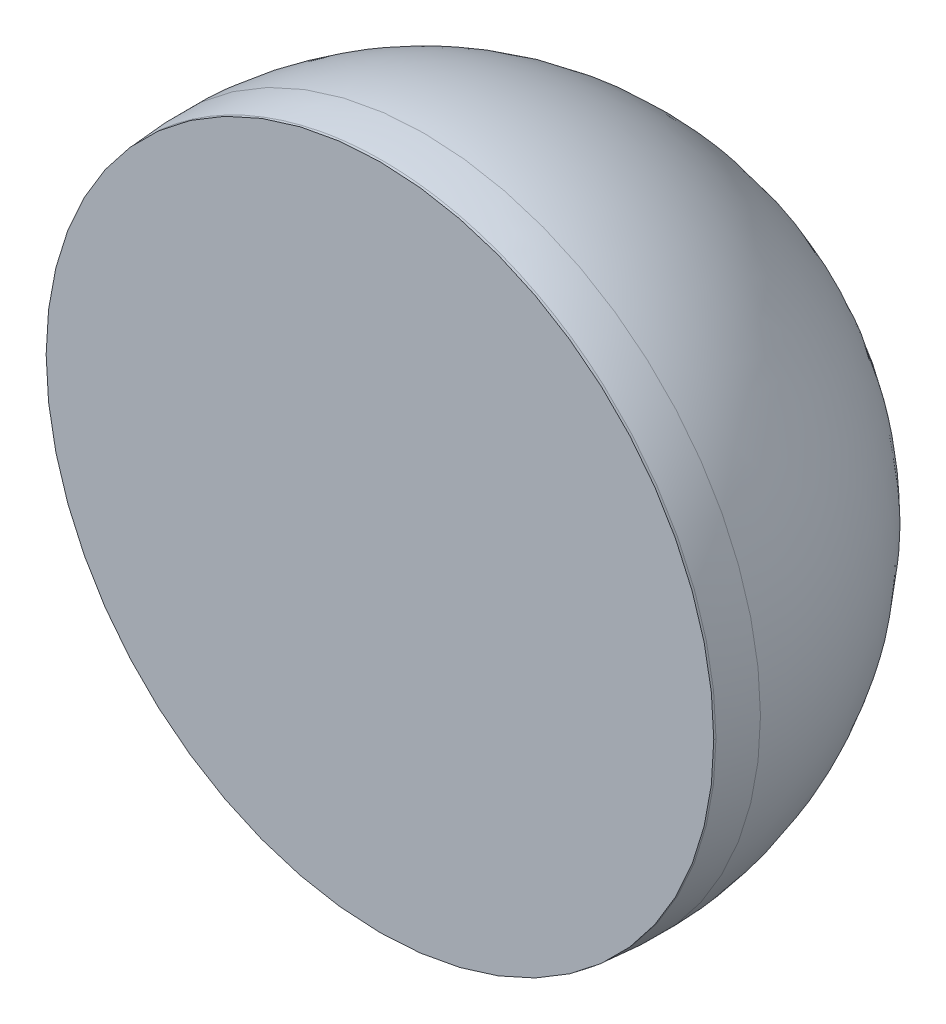
ISO-10303-21;
HEADER;
FILE_DESCRIPTION(('STEP AP214'),'2;1');
FILE_NAME('part.step','',(''),(''),'','','');
FILE_SCHEMA(('AUTOMOTIVE_DESIGN { 1 0 10303 214 1 1 1 1 }'));
ENDSEC;
DATA;
#1=APPLICATION_CONTEXT('core data for automotive mechanical design processes');
#2=APPLICATION_PROTOCOL_DEFINITION('international standard','automotive_design',2000,#1);
#3=PRODUCT_CONTEXT('',#1,'mechanical');
#4=PRODUCT('Part','Part','',(#3));
#5=PRODUCT_RELATED_PRODUCT_CATEGORY('part','',(#4));
#6=PRODUCT_DEFINITION_FORMATION('','',#4);
#7=PRODUCT_DEFINITION_CONTEXT('part definition',#1,'design');
#8=PRODUCT_DEFINITION('design','',#6,#7);
#9=PRODUCT_DEFINITION_SHAPE('','',#8);
#10=(LENGTH_UNIT() NAMED_UNIT(*) SI_UNIT(.MILLI.,.METRE.));
#11=(NAMED_UNIT(*) PLANE_ANGLE_UNIT() SI_UNIT($,.RADIAN.));
#12=(NAMED_UNIT(*) SI_UNIT($,.STERADIAN.) SOLID_ANGLE_UNIT());
#13=UNCERTAINTY_MEASURE_WITH_UNIT(LENGTH_MEASURE(1.E-05),#10,'distance_accuracy_value','');
#14=(GEOMETRIC_REPRESENTATION_CONTEXT(3) GLOBAL_UNCERTAINTY_ASSIGNED_CONTEXT((#13)) GLOBAL_UNIT_ASSIGNED_CONTEXT((#10,
#11,#12)) REPRESENTATION_CONTEXT('',''));
#15=CARTESIAN_POINT('',(0.,0.,0.));
#16=DIRECTION('',(0.,0.,1.));
#17=DIRECTION('',(1.,0.,0.));
#18=AXIS2_PLACEMENT_3D('',#15,#16,#17);
#19=CARTESIAN_POINT('',(27.625,50.1625,1.346800003052));
#20=DIRECTION('',(0.,0.,-1.));
#21=DIRECTION('',(0.,-1.,0.));
#22=AXIS2_PLACEMENT_3D('',#19,#20,#21);
#23=PLANE('',#22);
#24=CARTESIAN_POINT('',(27.625,50.1625,1.346800003052));
#25=DIRECTION('',(0.,0.,-1.));
#26=DIRECTION('',(-1.,0.,0.));
#27=AXIS2_PLACEMENT_3D('',#24,#25,#26);
#28=CIRCLE('',#27,0.15);
#29=CARTESIAN_POINT('',(27.475,50.1625,1.346800003052));
#30=VERTEX_POINT('',#29);
#31=CARTESIAN_POINT('',(27.775,50.1625,1.346800003052));
#32=VERTEX_POINT('',#31);
#33=EDGE_CURVE('E70',#30,#32,#28,.T.);
#34=ORIENTED_EDGE('',*,*,#33,.F.);
#35=CARTESIAN_POINT('',(27.625,50.1625,1.346800003052));
#36=DIRECTION('',(0.,0.,-1.));
#37=DIRECTION('',(-1.,0.,0.));
#38=AXIS2_PLACEMENT_3D('',#35,#36,#37);
#39=CIRCLE('',#38,0.15);
#40=EDGE_CURVE('E11',#32,#30,#39,.T.);
#41=ORIENTED_EDGE('',*,*,#40,.F.);
#42=EDGE_LOOP('',(#34,#41));
#43=FACE_BOUND('',#42,.T.);
#44=ADVANCED_FACE('F17',(#43),#23,.F.);
#45=CARTESIAN_POINT('',(27.625,50.1625,1.345800003052));
#46=DIRECTION('',(0.,0.,-1.));
#47=DIRECTION('',(-1.,0.,0.));
#48=AXIS2_PLACEMENT_3D('',#45,#46,#47);
#49=CYLINDRICAL_SURFACE('',#48,0.15);
#50=DIRECTION('',(0.,0.,-1.));
#51=VECTOR('',#50,1.);
#52=CARTESIAN_POINT('',(27.775,50.1625,1.345800003052));
#53=LINE('',#52,#51);
#54=CARTESIAN_POINT('',(27.775,50.1625,1.345800003052));
#55=VERTEX_POINT('',#54);
#56=EDGE_CURVE('E91',#32,#55,#53,.T.);
#57=ORIENTED_EDGE('',*,*,#56,.F.);
#58=ORIENTED_EDGE('',*,*,#40,.T.);
#59=DIRECTION('',(0.,0.,-1.));
#60=VECTOR('',#59,1.);
#61=CARTESIAN_POINT('',(27.475,50.1625,1.345800003052));
#62=LINE('',#61,#60);
#63=CARTESIAN_POINT('',(27.475,50.1625,1.345800003052));
#64=VERTEX_POINT('',#63);
#65=EDGE_CURVE('E104',#30,#64,#62,.T.);
#66=ORIENTED_EDGE('',*,*,#65,.T.);
#67=CARTESIAN_POINT('',(27.625,50.1625,1.345800003052));
#68=DIRECTION('',(0.,0.,-1.));
#69=DIRECTION('',(-1.,0.,0.));
#70=AXIS2_PLACEMENT_3D('',#67,#68,#69);
#71=CIRCLE('',#70,0.15);
#72=EDGE_CURVE('E27',#55,#64,#71,.T.);
#73=ORIENTED_EDGE('',*,*,#72,.F.);
#74=EDGE_LOOP('',(#57,#58,#66,#73));
#75=FACE_BOUND('',#74,.T.);
#76=ADVANCED_FACE('F140',(#75),#49,.T.);
#77=CARTESIAN_POINT('',(27.625,50.313676470588,1.32697647364));
#78=CARTESIAN_POINT('',(27.625,50.3136764705881,1.32697647364));
#79=CARTESIAN_POINT('',(27.625,50.3136764705881,1.32697647364));
#80=CARTESIAN_POINT('',(27.625,50.313676470588,1.32697647364));
#81=CARTESIAN_POINT('',(27.322647058824,50.3136764705881,1.32697647364));
#82=CARTESIAN_POINT('',(27.322647058824,50.313676470588,1.931682355993));
#83=CARTESIAN_POINT('',(27.927352941176,50.313676470588,1.931682355993));
#84=CARTESIAN_POINT('',(27.927352941176,50.3136764705881,1.32697647364));
#85=CARTESIAN_POINT('',(27.322647058824,50.011323529412,1.32697647364));
#86=CARTESIAN_POINT('',(27.322647058824,50.011323529412,1.931682355993));
#87=CARTESIAN_POINT('',(27.927352941176,50.011323529412,1.931682355993));
#88=CARTESIAN_POINT('',(27.927352941176,50.011323529412,1.32697647364));
#89=CARTESIAN_POINT('',(27.625,50.011323529412,1.32697647364));
#90=CARTESIAN_POINT('',(27.625,50.011323529412,1.32697647364));
#91=CARTESIAN_POINT('',(27.625,50.011323529412,1.32697647364));
#92=CARTESIAN_POINT('',(27.625,50.011323529412,1.32697647364));
#93=(BOUNDED_SURFACE() B_SPLINE_SURFACE(3,3,((#77,#78,#79,#80),(#81,#82,#83,#84),(#85,#86,#87,
#88),(#89,#90,#91,#92)),.UNSPECIFIED.,.F.,.F.,.F.) B_SPLINE_SURFACE_WITH_KNOTS((4,4),(4,4),(0.,
1.),(0.,1.),.UNSPECIFIED.) GEOMETRIC_REPRESENTATION_ITEM() RATIONAL_B_SPLINE_SURFACE(((1.,
0.333333333333,0.333333333333,1.),(0.333333333333,0.111111111111,0.111111111111,0.333333333333),
(0.333333333333,0.111111111111,0.111111111111,0.333333333333),(1.,0.333333333333,0.333333333333,1.))) REPRESENTATION_ITEM('') SURFACE());
#94=CARTESIAN_POINT('',(27.625,50.1625,1.345800003052));
#95=DIRECTION('',(0.,0.,-1.));
#96=DIRECTION('',(-1.,0.,0.));
#97=AXIS2_PLACEMENT_3D('',#94,#95,#96);
#98=CIRCLE('',#97,0.15);
#99=EDGE_CURVE('E98',#64,#55,#98,.T.);
#100=CARTESIAN_POINT('',(27.625,50.1625,1.32697647364));
#101=DIRECTION('',(0.,0.,-1.));
#102=DIRECTION('',(0.,1.,0.));
#103=AXIS2_PLACEMENT_3D('',#100,#101,#102);
#104=CIRCLE('',#103,0.151176470588);
#105=CARTESIAN_POINT('',(27.625,50.313676470588,1.32697647364));
#106=VERTEX_POINT('',#105);
#107=CARTESIAN_POINT('',(27.625,50.011323529412,1.32697647364));
#108=VERTEX_POINT('',#107);
#109=EDGE_CURVE('E65',#106,#108,#104,.T.);
#110=CARTESIAN_POINT('',(27.625,50.1625,1.32697647364));
#111=DIRECTION('',(0.,0.,1.));
#112=DIRECTION('',(0.,1.,0.));
#113=AXIS2_PLACEMENT_3D('',#110,#111,#112);
#114=CIRCLE('',#113,0.151176470588);
#115=EDGE_CURVE('E20',#106,#108,#114,.T.);
#116=ORIENTED_EDGE('',*,*,#99,.T.);
#117=ORIENTED_EDGE('',*,*,#72,.T.);
#118=EDGE_LOOP('',(#116,#117));
#119=FACE_BOUND('',#118,.T.);
#120=ORIENTED_EDGE('',*,*,#109,.F.);
#121=ORIENTED_EDGE('',*,*,#115,.T.);
#122=EDGE_LOOP('',(#120,#121));
#123=FACE_BOUND('',#122,.T.);
#124=ADVANCED_FACE('F72',(#119,#123),#93,.T.);
#125=CARTESIAN_POINT('',(27.625,50.1625,1.345800003052));
#126=DIRECTION('',(0.,0.,-1.));
#127=DIRECTION('',(-1.,0.,0.));
#128=AXIS2_PLACEMENT_3D('',#125,#126,#127);
#129=CYLINDRICAL_SURFACE('',#128,0.15);
#130=ORIENTED_EDGE('',*,*,#33,.T.);
#131=ORIENTED_EDGE('',*,*,#56,.T.);
#132=ORIENTED_EDGE('',*,*,#99,.F.);
#133=ORIENTED_EDGE('',*,*,#65,.F.);
#134=EDGE_LOOP('',(#130,#131,#132,#133));
#135=FACE_BOUND('',#134,.T.);
#136=ADVANCED_FACE('F121',(#135),#129,.T.);
#137=CARTESIAN_POINT('',(27.625,50.313676470588,1.32697647364));
#138=CARTESIAN_POINT('',(27.625,50.3136764705881,1.32697647364));
#139=CARTESIAN_POINT('',(27.625,50.3136764705881,1.32697647364));
#140=CARTESIAN_POINT('',(27.625,50.313676470588,1.32697647364));
#141=CARTESIAN_POINT('',(27.927352941176,50.3136764705881,1.32697647364));
#142=CARTESIAN_POINT('',(27.927352941176,50.313676470588,0.722270591287));
#143=CARTESIAN_POINT('',(27.322647058824,50.313676470588,0.722270591287));
#144=CARTESIAN_POINT('',(27.322647058824,50.3136764705881,1.32697647364));
#145=CARTESIAN_POINT('',(27.927352941176,50.011323529412,1.32697647364));
#146=CARTESIAN_POINT('',(27.927352941176,50.011323529412,0.722270591287));
#147=CARTESIAN_POINT('',(27.322647058824,50.011323529412,0.722270591287));
#148=CARTESIAN_POINT('',(27.322647058824,50.011323529412,1.32697647364));
#149=CARTESIAN_POINT('',(27.625,50.011323529412,1.32697647364));
#150=CARTESIAN_POINT('',(27.625,50.011323529412,1.32697647364));
#151=CARTESIAN_POINT('',(27.625,50.011323529412,1.32697647364));
#152=CARTESIAN_POINT('',(27.625,50.011323529412,1.32697647364));
#153=(BOUNDED_SURFACE() B_SPLINE_SURFACE(3,3,((#137,#138,#139,#140),(#141,#142,#143,#144),(#145,
#146,#147,#148),(#149,#150,#151,#152)),.UNSPECIFIED.,.F.,.F.,
.F.) B_SPLINE_SURFACE_WITH_KNOTS((4,4),(4,4),(0.,1.),(0.,1.),
.UNSPECIFIED.) GEOMETRIC_REPRESENTATION_ITEM() RATIONAL_B_SPLINE_SURFACE(((1.,0.333333333333,
0.333333333333,1.),(0.333333333333,0.111111111111,0.111111111111,0.333333333333),
(0.333333333333,0.111111111111,0.111111111111,0.333333333333),(1.,0.333333333333,0.333333333333,1.))) REPRESENTATION_ITEM('') SURFACE());
#154=ORIENTED_EDGE('',*,*,#115,.F.);
#155=ORIENTED_EDGE('',*,*,#109,.T.);
#156=EDGE_LOOP('',(#154,#155));
#157=FACE_BOUND('',#156,.T.);
#158=ADVANCED_FACE('F67',(#157),#153,.T.);
#159=CLOSED_SHELL('',(#44,#76,#124,#136,#158));
#160=MANIFOLD_SOLID_BREP('B1',#159);
#161=ADVANCED_BREP_SHAPE_REPRESENTATION('',(#18,#160),#14);
#162=SHAPE_DEFINITION_REPRESENTATION(#9,#161);
ENDSEC;
END-ISO-10303-21;
